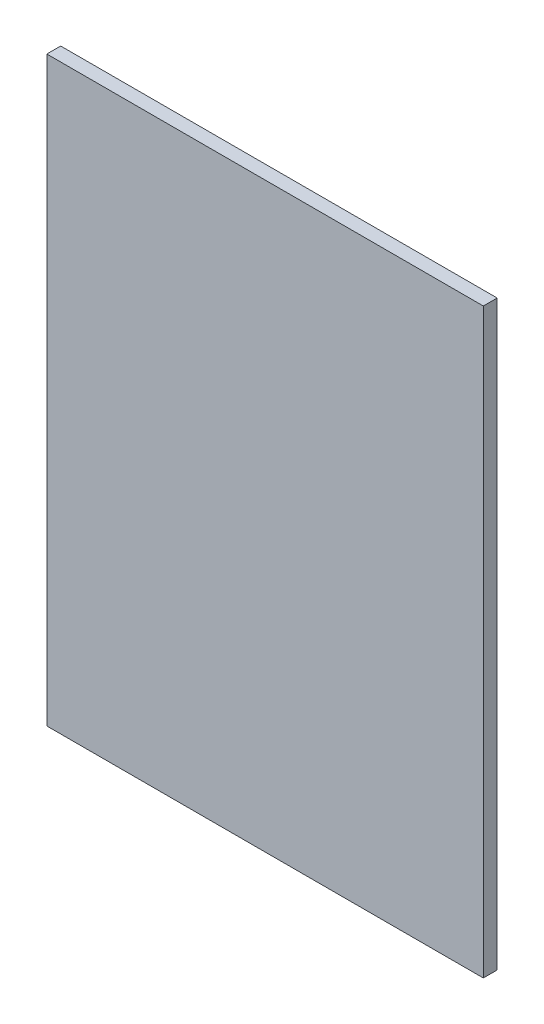
ISO-10303-21;
HEADER;
FILE_DESCRIPTION(('STEP AP214'),'2;1');
FILE_NAME('part.step','',(''),(''),'','','');
FILE_SCHEMA(('AUTOMOTIVE_DESIGN { 1 0 10303 214 1 1 1 1 }'));
ENDSEC;
DATA;
#1=APPLICATION_CONTEXT('core data for automotive mechanical design processes');
#2=APPLICATION_PROTOCOL_DEFINITION('international standard','automotive_design',2000,#1);
#3=PRODUCT_CONTEXT('',#1,'mechanical');
#4=PRODUCT('Part','Part','',(#3));
#5=PRODUCT_RELATED_PRODUCT_CATEGORY('part','',(#4));
#6=PRODUCT_DEFINITION_FORMATION('','',#4);
#7=PRODUCT_DEFINITION_CONTEXT('part definition',#1,'design');
#8=PRODUCT_DEFINITION('design','',#6,#7);
#9=PRODUCT_DEFINITION_SHAPE('','',#8);
#10=(LENGTH_UNIT() NAMED_UNIT(*) SI_UNIT(.MILLI.,.METRE.));
#11=(NAMED_UNIT(*) PLANE_ANGLE_UNIT() SI_UNIT($,.RADIAN.));
#12=(NAMED_UNIT(*) SI_UNIT($,.STERADIAN.) SOLID_ANGLE_UNIT());
#13=UNCERTAINTY_MEASURE_WITH_UNIT(LENGTH_MEASURE(1.E-05),#10,'distance_accuracy_value','');
#14=(GEOMETRIC_REPRESENTATION_CONTEXT(3) GLOBAL_UNCERTAINTY_ASSIGNED_CONTEXT((#13)) GLOBAL_UNIT_ASSIGNED_CONTEXT((#10,
#11,#12)) REPRESENTATION_CONTEXT('',''));
#15=CARTESIAN_POINT('',(0.,0.,0.));
#16=DIRECTION('',(0.,0.,1.));
#17=DIRECTION('',(1.,0.,0.));
#18=AXIS2_PLACEMENT_3D('',#15,#16,#17);
#19=CARTESIAN_POINT('',(0.,0.,4.7625));
#20=DIRECTION('',(1.,0.,0.));
#21=DIRECTION('',(0.,0.,-1.));
#22=AXIS2_PLACEMENT_3D('',#19,#20,#21);
#23=PLANE('',#22);
#24=DIRECTION('',(0.,-1.,0.));
#25=VECTOR('',#24,1.);
#26=CARTESIAN_POINT('',(0.,0.,0.));
#27=LINE('',#26,#25);
#28=CARTESIAN_POINT('',(0.,200.,0.));
#29=VERTEX_POINT('',#28);
#30=CARTESIAN_POINT('',(0.,0.,0.));
#31=VERTEX_POINT('',#30);
#32=EDGE_CURVE('E96',#29,#31,#27,.T.);
#33=ORIENTED_EDGE('',*,*,#32,.T.);
#34=DIRECTION('',(0.,0.,-1.));
#35=VECTOR('',#34,1.);
#36=CARTESIAN_POINT('',(0.,0.,4.7625));
#37=LINE('',#36,#35);
#38=CARTESIAN_POINT('',(0.,0.,4.7625));
#39=VERTEX_POINT('',#38);
#40=EDGE_CURVE('E11',#39,#31,#37,.T.);
#41=ORIENTED_EDGE('',*,*,#40,.F.);
#42=DIRECTION('',(0.,-1.,0.));
#43=VECTOR('',#42,1.);
#44=CARTESIAN_POINT('',(0.,0.,4.7625));
#45=LINE('',#44,#43);
#46=CARTESIAN_POINT('',(0.,200.,4.7625));
#47=VERTEX_POINT('',#46);
#48=EDGE_CURVE('E84',#47,#39,#45,.T.);
#49=ORIENTED_EDGE('',*,*,#48,.F.);
#50=DIRECTION('',(0.,0.,-1.));
#51=VECTOR('',#50,1.);
#52=CARTESIAN_POINT('',(0.,200.,4.7625));
#53=LINE('',#52,#51);
#54=EDGE_CURVE('E92',#47,#29,#53,.T.);
#55=ORIENTED_EDGE('',*,*,#54,.T.);
#56=EDGE_LOOP('',(#33,#41,#49,#55));
#57=FACE_BOUND('',#56,.T.);
#58=ADVANCED_FACE('F33',(#57),#23,.F.);
#59=CARTESIAN_POINT('',(0.,0.,4.7625));
#60=DIRECTION('',(0.,1.,0.));
#61=DIRECTION('',(0.,0.,1.));
#62=AXIS2_PLACEMENT_3D('',#59,#60,#61);
#63=PLANE('',#62);
#64=DIRECTION('',(1.,0.,0.));
#65=VECTOR('',#64,1.);
#66=CARTESIAN_POINT('',(0.,0.,0.));
#67=LINE('',#66,#65);
#68=CARTESIAN_POINT('',(150.,0.,0.));
#69=VERTEX_POINT('',#68);
#70=EDGE_CURVE('E88',#31,#69,#67,.T.);
#71=ORIENTED_EDGE('',*,*,#70,.T.);
#72=DIRECTION('',(0.,0.,-1.));
#73=VECTOR('',#72,1.);
#74=CARTESIAN_POINT('',(150.,0.,4.7625));
#75=LINE('',#74,#73);
#76=CARTESIAN_POINT('',(150.,0.,4.7625));
#77=VERTEX_POINT('',#76);
#78=EDGE_CURVE('E41',#77,#69,#75,.T.);
#79=ORIENTED_EDGE('',*,*,#78,.F.);
#80=DIRECTION('',(1.,0.,0.));
#81=VECTOR('',#80,1.);
#82=CARTESIAN_POINT('',(0.,0.,4.7625));
#83=LINE('',#82,#81);
#84=EDGE_CURVE('E79',#39,#77,#83,.T.);
#85=ORIENTED_EDGE('',*,*,#84,.F.);
#86=ORIENTED_EDGE('',*,*,#40,.T.);
#87=EDGE_LOOP('',(#71,#79,#85,#86));
#88=FACE_BOUND('',#87,.T.);
#89=ADVANCED_FACE('F87',(#88),#63,.F.);
#90=CARTESIAN_POINT('',(150.,0.,4.7625));
#91=DIRECTION('',(-1.,0.,0.));
#92=DIRECTION('',(0.,0.,1.));
#93=AXIS2_PLACEMENT_3D('',#90,#91,#92);
#94=PLANE('',#93);
#95=DIRECTION('',(0.,1.,0.));
#96=VECTOR('',#95,1.);
#97=CARTESIAN_POINT('',(150.,0.,0.));
#98=LINE('',#97,#96);
#99=CARTESIAN_POINT('',(150.,200.,0.));
#100=VERTEX_POINT('',#99);
#101=EDGE_CURVE('E66',#69,#100,#98,.T.);
#102=ORIENTED_EDGE('',*,*,#101,.T.);
#103=DIRECTION('',(0.,0.,-1.));
#104=VECTOR('',#103,1.);
#105=CARTESIAN_POINT('',(150.,200.,4.7625));
#106=LINE('',#105,#104);
#107=CARTESIAN_POINT('',(150.,200.,4.7625));
#108=VERTEX_POINT('',#107);
#109=EDGE_CURVE('E89',#108,#100,#106,.T.);
#110=ORIENTED_EDGE('',*,*,#109,.F.);
#111=DIRECTION('',(0.,1.,0.));
#112=VECTOR('',#111,1.);
#113=CARTESIAN_POINT('',(150.,0.,4.7625));
#114=LINE('',#113,#112);
#115=EDGE_CURVE('E82',#77,#108,#114,.T.);
#116=ORIENTED_EDGE('',*,*,#115,.F.);
#117=ORIENTED_EDGE('',*,*,#78,.T.);
#118=EDGE_LOOP('',(#102,#110,#116,#117));
#119=FACE_BOUND('',#118,.T.);
#120=ADVANCED_FACE('F90',(#119),#94,.F.);
#121=CARTESIAN_POINT('',(0.,200.,4.7625));
#122=DIRECTION('',(0.,-1.,0.));
#123=DIRECTION('',(0.,0.,-1.));
#124=AXIS2_PLACEMENT_3D('',#121,#122,#123);
#125=PLANE('',#124);
#126=DIRECTION('',(-1.,0.,0.));
#127=VECTOR('',#126,1.);
#128=CARTESIAN_POINT('',(0.,200.,0.));
#129=LINE('',#128,#127);
#130=EDGE_CURVE('E72',#100,#29,#129,.T.);
#131=ORIENTED_EDGE('',*,*,#130,.T.);
#132=ORIENTED_EDGE('',*,*,#54,.F.);
#133=DIRECTION('',(-1.,0.,0.));
#134=VECTOR('',#133,1.);
#135=CARTESIAN_POINT('',(0.,200.,4.7625));
#136=LINE('',#135,#134);
#137=EDGE_CURVE('E49',#108,#47,#136,.T.);
#138=ORIENTED_EDGE('',*,*,#137,.F.);
#139=ORIENTED_EDGE('',*,*,#109,.T.);
#140=EDGE_LOOP('',(#131,#132,#138,#139));
#141=FACE_BOUND('',#140,.T.);
#142=ADVANCED_FACE('F103',(#141),#125,.F.);
#143=CARTESIAN_POINT('',(0.,0.,4.7625));
#144=DIRECTION('',(0.,0.,-1.));
#145=DIRECTION('',(-1.,0.,0.));
#146=AXIS2_PLACEMENT_3D('',#143,#144,#145);
#147=PLANE('',#146);
#148=ORIENTED_EDGE('',*,*,#48,.T.);
#149=ORIENTED_EDGE('',*,*,#84,.T.);
#150=ORIENTED_EDGE('',*,*,#115,.T.);
#151=ORIENTED_EDGE('',*,*,#137,.T.);
#152=EDGE_LOOP('',(#148,#149,#150,#151));
#153=FACE_BOUND('',#152,.T.);
#154=ADVANCED_FACE('F80',(#153),#147,.F.);
#155=CARTESIAN_POINT('',(0.,0.,0.));
#156=DIRECTION('',(0.,0.,-1.));
#157=DIRECTION('',(-1.,0.,0.));
#158=AXIS2_PLACEMENT_3D('',#155,#156,#157);
#159=PLANE('',#158);
#160=ORIENTED_EDGE('',*,*,#32,.F.);
#161=ORIENTED_EDGE('',*,*,#130,.F.);
#162=ORIENTED_EDGE('',*,*,#101,.F.);
#163=ORIENTED_EDGE('',*,*,#70,.F.);
#164=EDGE_LOOP('',(#160,#161,#162,#163));
#165=FACE_BOUND('',#164,.T.);
#166=ADVANCED_FACE('F106',(#165),#159,.T.);
#167=CLOSED_SHELL('',(#58,#89,#120,#142,#154,#166));
#168=MANIFOLD_SOLID_BREP('B2',#167);
#169=ADVANCED_BREP_SHAPE_REPRESENTATION('',(#18,#168),#14);
#170=SHAPE_DEFINITION_REPRESENTATION(#9,#169);
ENDSEC;
END-ISO-10303-21;
